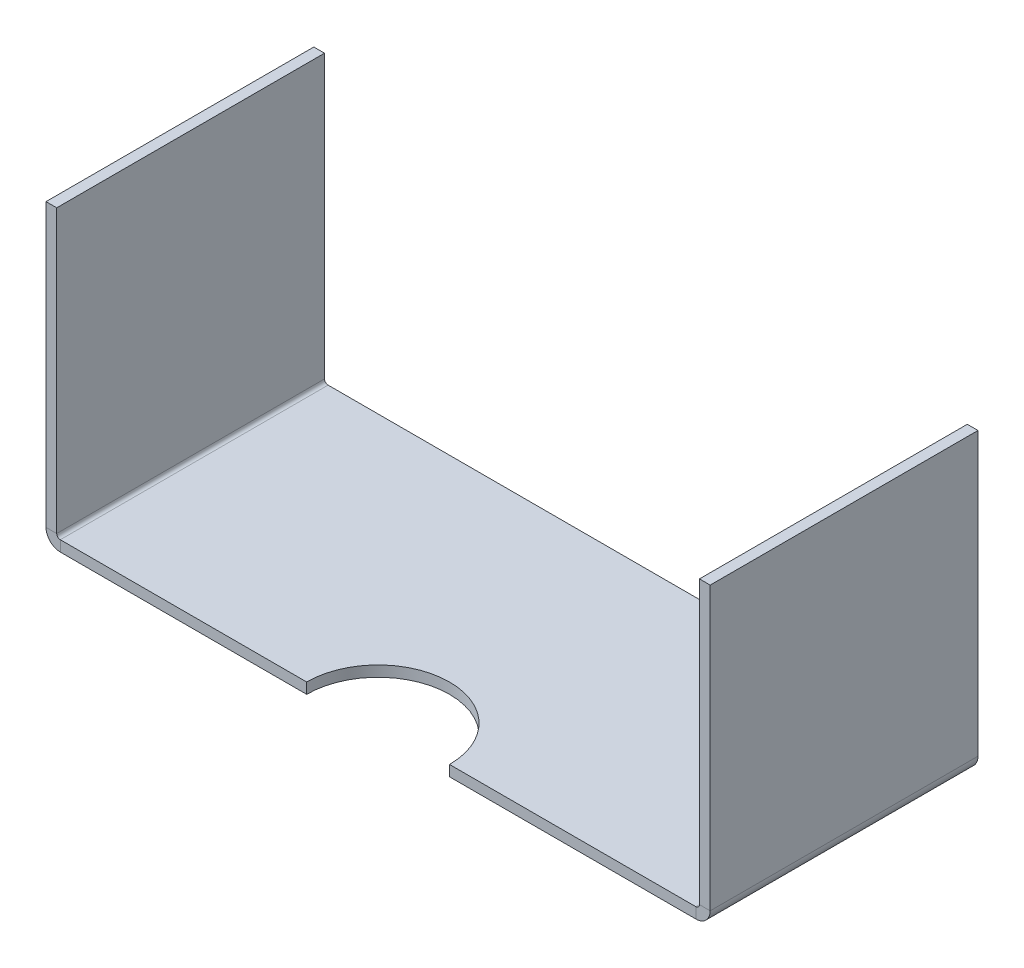
ISO-10303-21;
HEADER;
FILE_DESCRIPTION(('STEP AP214'),'2;1');
FILE_NAME('part.step','',(''),(''),'','','');
FILE_SCHEMA(('AUTOMOTIVE_DESIGN { 1 0 10303 214 1 1 1 1 }'));
ENDSEC;
DATA;
#1=APPLICATION_CONTEXT('core data for automotive mechanical design processes');
#2=APPLICATION_PROTOCOL_DEFINITION('international standard','automotive_design',2000,#1);
#3=PRODUCT_CONTEXT('',#1,'mechanical');
#4=PRODUCT('Part','Part','',(#3));
#5=PRODUCT_RELATED_PRODUCT_CATEGORY('part','',(#4));
#6=PRODUCT_DEFINITION_FORMATION('','',#4);
#7=PRODUCT_DEFINITION_CONTEXT('part definition',#1,'design');
#8=PRODUCT_DEFINITION('design','',#6,#7);
#9=PRODUCT_DEFINITION_SHAPE('','',#8);
#10=(LENGTH_UNIT() NAMED_UNIT(*) SI_UNIT(.MILLI.,.METRE.));
#11=(NAMED_UNIT(*) PLANE_ANGLE_UNIT() SI_UNIT($,.RADIAN.));
#12=(NAMED_UNIT(*) SI_UNIT($,.STERADIAN.) SOLID_ANGLE_UNIT());
#13=UNCERTAINTY_MEASURE_WITH_UNIT(LENGTH_MEASURE(1.E-05),#10,'distance_accuracy_value','');
#14=(GEOMETRIC_REPRESENTATION_CONTEXT(3) GLOBAL_UNCERTAINTY_ASSIGNED_CONTEXT((#13)) GLOBAL_UNIT_ASSIGNED_CONTEXT((#10,
#11,#12)) REPRESENTATION_CONTEXT('',''));
#15=CARTESIAN_POINT('',(0.,0.,0.));
#16=DIRECTION('',(0.,0.,1.));
#17=DIRECTION('',(1.,0.,0.));
#18=AXIS2_PLACEMENT_3D('',#15,#16,#17);
#19=CARTESIAN_POINT('',(-3.,1.,75.));
#20=DIRECTION('',(0.,0.,1.));
#21=DIRECTION('',(1.,0.,0.));
#22=AXIS2_PLACEMENT_3D('',#19,#20,#21);
#23=PLANE('',#22);
#24=DIRECTION('',(0.,1.,0.));
#25=VECTOR('',#24,1.);
#26=CARTESIAN_POINT('',(110.,-3.,75.));
#27=LINE('',#26,#25);
#28=CARTESIAN_POINT('',(110.,-3.,75.));
#29=VERTEX_POINT('',#28);
#30=CARTESIAN_POINT('',(110.,0.,75.));
#31=VERTEX_POINT('',#30);
#32=EDGE_CURVE('E184',#29,#31,#27,.T.);
#33=ORIENTED_EDGE('',*,*,#32,.F.);
#34=DIRECTION('',(1.,0.,0.));
#35=VECTOR('',#34,1.);
#36=CARTESIAN_POINT('',(0.,-3.,75.));
#37=LINE('',#36,#35);
#38=CARTESIAN_POINT('',(179.,-3.,75.));
#39=VERTEX_POINT('',#38);
#40=EDGE_CURVE('E156',#29,#39,#37,.T.);
#41=ORIENTED_EDGE('',*,*,#40,.T.);
#42=DIRECTION('',(1.11022302462516E-13,1.,0.));
#43=VECTOR('',#42,1.);
#44=CARTESIAN_POINT('',(179.,-3.,75.));
#45=LINE('',#44,#43);
#46=CARTESIAN_POINT('',(179.,0.,75.));
#47=VERTEX_POINT('',#46);
#48=EDGE_CURVE('E240',#39,#47,#45,.T.);
#49=ORIENTED_EDGE('',*,*,#48,.T.);
#50=DIRECTION('',(1.,0.,0.));
#51=VECTOR('',#50,1.);
#52=CARTESIAN_POINT('',(0.,0.,75.));
#53=LINE('',#52,#51);
#54=EDGE_CURVE('E270',#31,#47,#53,.T.);
#55=ORIENTED_EDGE('',*,*,#54,.F.);
#56=EDGE_LOOP('',(#33,#41,#49,#55));
#57=FACE_BOUND('',#56,.T.);
#58=ADVANCED_FACE('F35',(#57),#23,.T.);
#59=CARTESIAN_POINT('',(0.999999999999999,0.,75.));
#60=DIRECTION('',(0.,0.,1.));
#61=DIRECTION('',(1.,0.,0.));
#62=AXIS2_PLACEMENT_3D('',#59,#60,#61);
#63=PLANE('',#62);
#64=DIRECTION('',(0.,-1.,0.));
#65=VECTOR('',#64,1.);
#66=CARTESIAN_POINT('',(0.999999999999999,0.,75.));
#67=LINE('',#66,#65);
#68=CARTESIAN_POINT('',(0.999999999999999,0.,75.));
#69=VERTEX_POINT('',#68);
#70=CARTESIAN_POINT('',(0.999999999999999,-3.,75.));
#71=VERTEX_POINT('',#70);
#72=EDGE_CURVE('E11',#69,#71,#67,.T.);
#73=ORIENTED_EDGE('',*,*,#72,.F.);
#74=CARTESIAN_POINT('',(1.,1.,75.));
#75=DIRECTION('',(0.,0.,-1.));
#76=DIRECTION('',(-1.,0.,0.));
#77=AXIS2_PLACEMENT_3D('',#74,#75,#76);
#78=CIRCLE('',#77,1.);
#79=CARTESIAN_POINT('',(0.,1.,75.));
#80=VERTEX_POINT('',#79);
#81=EDGE_CURVE('E260',#80,#69,#78,.F.);
#82=ORIENTED_EDGE('',*,*,#81,.F.);
#83=DIRECTION('',(1.,0.,0.));
#84=VECTOR('',#83,1.);
#85=CARTESIAN_POINT('',(-3.,1.,75.));
#86=LINE('',#85,#84);
#87=CARTESIAN_POINT('',(-3.,1.,75.));
#88=VERTEX_POINT('',#87);
#89=EDGE_CURVE('E43',#88,#80,#86,.T.);
#90=ORIENTED_EDGE('',*,*,#89,.F.);
#91=CARTESIAN_POINT('',(1.,1.,75.));
#92=DIRECTION('',(0.,0.,1.));
#93=DIRECTION('',(1.,0.,0.));
#94=AXIS2_PLACEMENT_3D('',#91,#92,#93);
#95=CIRCLE('',#94,4.);
#96=EDGE_CURVE('E151',#88,#71,#95,.T.);
#97=ORIENTED_EDGE('',*,*,#96,.T.);
#98=EDGE_LOOP('',(#73,#82,#90,#97));
#99=FACE_BOUND('',#98,.T.);
#100=ADVANCED_FACE('F37',(#99),#63,.T.);
#101=DIRECTION('',(0.,1.,0.));
#102=VECTOR('',#101,1.);
#103=CARTESIAN_POINT('',(69.9999999999999,-3.,75.));
#104=LINE('',#103,#102);
#105=CARTESIAN_POINT('',(69.9999999999999,0.,75.));
#106=VERTEX_POINT('',#105);
#107=CARTESIAN_POINT('',(69.9999999999999,-3.,75.));
#108=VERTEX_POINT('',#107);
#109=EDGE_CURVE('E50',#106,#108,#104,.F.);
#110=ORIENTED_EDGE('',*,*,#109,.F.);
#111=EDGE_CURVE('E145',#69,#106,#53,.T.);
#112=ORIENTED_EDGE('',*,*,#111,.F.);
#113=ORIENTED_EDGE('',*,*,#72,.T.);
#114=EDGE_CURVE('E143',#71,#108,#37,.T.);
#115=ORIENTED_EDGE('',*,*,#114,.T.);
#116=EDGE_LOOP('',(#110,#112,#113,#115));
#117=FACE_BOUND('',#116,.T.);
#118=ADVANCED_FACE('F141',(#117),#23,.T.);
#119=CARTESIAN_POINT('',(0.,1.,0.));
#120=DIRECTION('',(0.,0.,-1.));
#121=DIRECTION('',(-1.,0.,0.));
#122=AXIS2_PLACEMENT_3D('',#119,#120,#121);
#123=PLANE('',#122);
#124=DIRECTION('',(-1.,0.,0.));
#125=VECTOR('',#124,1.);
#126=CARTESIAN_POINT('',(0.,1.,0.));
#127=LINE('',#126,#125);
#128=CARTESIAN_POINT('',(0.,1.,0.));
#129=VERTEX_POINT('',#128);
#130=CARTESIAN_POINT('',(-3.,1.,0.));
#131=VERTEX_POINT('',#130);
#132=EDGE_CURVE('E246',#129,#131,#127,.T.);
#133=ORIENTED_EDGE('',*,*,#132,.F.);
#134=CARTESIAN_POINT('',(1.,1.,0.));
#135=DIRECTION('',(0.,0.,-1.));
#136=DIRECTION('',(-1.,0.,0.));
#137=AXIS2_PLACEMENT_3D('',#134,#135,#136);
#138=CIRCLE('',#137,1.);
#139=CARTESIAN_POINT('',(0.999999999999999,0.,0.));
#140=VERTEX_POINT('',#139);
#141=EDGE_CURVE('E195',#129,#140,#138,.F.);
#142=ORIENTED_EDGE('',*,*,#141,.T.);
#143=DIRECTION('',(0.,1.,0.));
#144=VECTOR('',#143,1.);
#145=CARTESIAN_POINT('',(0.999999999999999,-3.,0.));
#146=LINE('',#145,#144);
#147=CARTESIAN_POINT('',(0.999999999999999,-3.,0.));
#148=VERTEX_POINT('',#147);
#149=EDGE_CURVE('E244',#148,#140,#146,.T.);
#150=ORIENTED_EDGE('',*,*,#149,.F.);
#151=CARTESIAN_POINT('',(1.,1.,0.));
#152=DIRECTION('',(0.,0.,1.));
#153=DIRECTION('',(1.,0.,0.));
#154=AXIS2_PLACEMENT_3D('',#151,#152,#153);
#155=CIRCLE('',#154,4.);
#156=EDGE_CURVE('E164',#131,#148,#155,.T.);
#157=ORIENTED_EDGE('',*,*,#156,.F.);
#158=EDGE_LOOP('',(#133,#142,#150,#157));
#159=FACE_BOUND('',#158,.T.);
#160=ADVANCED_FACE('F298',(#159),#123,.T.);
#161=CARTESIAN_POINT('',(0.999999999999999,-3.,0.));
#162=DIRECTION('',(0.,0.,-1.));
#163=DIRECTION('',(-1.,0.,0.));
#164=AXIS2_PLACEMENT_3D('',#161,#162,#163);
#165=PLANE('',#164);
#166=DIRECTION('',(0.,-1.,0.));
#167=VECTOR('',#166,1.);
#168=CARTESIAN_POINT('',(0.,0.,0.));
#169=LINE('',#168,#167);
#170=CARTESIAN_POINT('',(0.,80.,0.));
#171=VERTEX_POINT('',#170);
#172=EDGE_CURVE('E198',#171,#129,#169,.T.);
#173=ORIENTED_EDGE('',*,*,#172,.T.);
#174=ORIENTED_EDGE('',*,*,#132,.T.);
#175=DIRECTION('',(0.,1.,0.));
#176=VECTOR('',#175,1.);
#177=CARTESIAN_POINT('',(-3.,0.,0.));
#178=LINE('',#177,#176);
#179=CARTESIAN_POINT('',(-3.,80.,0.));
#180=VERTEX_POINT('',#179);
#181=EDGE_CURVE('E204',#180,#131,#178,.F.);
#182=ORIENTED_EDGE('',*,*,#181,.F.);
#183=DIRECTION('',(1.,0.,0.));
#184=VECTOR('',#183,1.);
#185=CARTESIAN_POINT('',(-3.,80.,0.));
#186=LINE('',#185,#184);
#187=EDGE_CURVE('E201',#180,#171,#186,.T.);
#188=ORIENTED_EDGE('',*,*,#187,.T.);
#189=EDGE_LOOP('',(#173,#174,#182,#188));
#190=FACE_BOUND('',#189,.T.);
#191=ADVANCED_FACE('F301',(#190),#165,.T.);
#192=CARTESIAN_POINT('',(180.,1.,75.));
#193=DIRECTION('',(0.,0.,1.));
#194=DIRECTION('',(1.,0.,0.));
#195=AXIS2_PLACEMENT_3D('',#192,#193,#194);
#196=PLANE('',#195);
#197=DIRECTION('',(1.,0.,0.));
#198=VECTOR('',#197,1.);
#199=CARTESIAN_POINT('',(180.,1.,75.));
#200=LINE('',#199,#198);
#201=CARTESIAN_POINT('',(180.,1.,75.));
#202=VERTEX_POINT('',#201);
#203=CARTESIAN_POINT('',(183.,1.,75.));
#204=VERTEX_POINT('',#203);
#205=EDGE_CURVE('E59',#202,#204,#200,.T.);
#206=ORIENTED_EDGE('',*,*,#205,.F.);
#207=CARTESIAN_POINT('',(179.,1.,75.));
#208=DIRECTION('',(0.,0.,-1.));
#209=DIRECTION('',(-1.,0.,0.));
#210=AXIS2_PLACEMENT_3D('',#207,#208,#209);
#211=CIRCLE('',#210,1.);
#212=EDGE_CURVE('E271',#47,#202,#211,.F.);
#213=ORIENTED_EDGE('',*,*,#212,.F.);
#214=ORIENTED_EDGE('',*,*,#48,.F.);
#215=CARTESIAN_POINT('',(179.,1.,75.));
#216=DIRECTION('',(0.,0.,1.));
#217=DIRECTION('',(1.,0.,0.));
#218=AXIS2_PLACEMENT_3D('',#215,#216,#217);
#219=CIRCLE('',#218,4.);
#220=EDGE_CURVE('E174',#39,#204,#219,.T.);
#221=ORIENTED_EDGE('',*,*,#220,.T.);
#222=EDGE_LOOP('',(#206,#213,#214,#221));
#223=FACE_BOUND('',#222,.T.);
#224=ADVANCED_FACE('F328',(#223),#196,.T.);
#225=CARTESIAN_POINT('',(179.,-3.,75.));
#226=DIRECTION('',(0.,0.,1.));
#227=DIRECTION('',(1.,0.,0.));
#228=AXIS2_PLACEMENT_3D('',#225,#226,#227);
#229=PLANE('',#228);
#230=DIRECTION('',(0.,1.,0.));
#231=VECTOR('',#230,1.);
#232=CARTESIAN_POINT('',(180.,0.,75.));
#233=LINE('',#232,#231);
#234=CARTESIAN_POINT('',(180.,80.,75.));
#235=VERTEX_POINT('',#234);
#236=EDGE_CURVE('E274',#202,#235,#233,.T.);
#237=ORIENTED_EDGE('',*,*,#236,.F.);
#238=ORIENTED_EDGE('',*,*,#205,.T.);
#239=DIRECTION('',(0.,1.,0.));
#240=VECTOR('',#239,1.);
#241=CARTESIAN_POINT('',(183.,0.,75.));
#242=LINE('',#241,#240);
#243=CARTESIAN_POINT('',(183.,80.,75.));
#244=VERTEX_POINT('',#243);
#245=EDGE_CURVE('E111',#204,#244,#242,.T.);
#246=ORIENTED_EDGE('',*,*,#245,.T.);
#247=DIRECTION('',(1.,0.,0.));
#248=VECTOR('',#247,1.);
#249=CARTESIAN_POINT('',(180.,80.,75.));
#250=LINE('',#249,#248);
#251=EDGE_CURVE('E277',#235,#244,#250,.T.);
#252=ORIENTED_EDGE('',*,*,#251,.F.);
#253=EDGE_LOOP('',(#237,#238,#246,#252));
#254=FACE_BOUND('',#253,.T.);
#255=ADVANCED_FACE('F333',(#254),#229,.T.);
#256=CARTESIAN_POINT('',(179.,0.,0.));
#257=DIRECTION('',(0.,0.,-1.));
#258=DIRECTION('',(-1.,0.,0.));
#259=AXIS2_PLACEMENT_3D('',#256,#257,#258);
#260=PLANE('',#259);
#261=DIRECTION('',(-1.11022302462516E-13,-1.,0.));
#262=VECTOR('',#261,1.);
#263=CARTESIAN_POINT('',(179.,0.,0.));
#264=LINE('',#263,#262);
#265=CARTESIAN_POINT('',(179.,0.,0.));
#266=VERTEX_POINT('',#265);
#267=CARTESIAN_POINT('',(179.,-3.,0.));
#268=VERTEX_POINT('',#267);
#269=EDGE_CURVE('E238',#266,#268,#264,.T.);
#270=ORIENTED_EDGE('',*,*,#269,.F.);
#271=CARTESIAN_POINT('',(179.,1.,0.));
#272=DIRECTION('',(0.,0.,-1.));
#273=DIRECTION('',(-1.,0.,0.));
#274=AXIS2_PLACEMENT_3D('',#271,#272,#273);
#275=CIRCLE('',#274,1.);
#276=CARTESIAN_POINT('',(180.,1.,0.));
#277=VERTEX_POINT('',#276);
#278=EDGE_CURVE('E190',#266,#277,#275,.F.);
#279=ORIENTED_EDGE('',*,*,#278,.T.);
#280=DIRECTION('',(-1.,0.,0.));
#281=VECTOR('',#280,1.);
#282=CARTESIAN_POINT('',(183.,1.,0.));
#283=LINE('',#282,#281);
#284=CARTESIAN_POINT('',(183.,1.,0.));
#285=VERTEX_POINT('',#284);
#286=EDGE_CURVE('E105',#285,#277,#283,.T.);
#287=ORIENTED_EDGE('',*,*,#286,.F.);
#288=CARTESIAN_POINT('',(179.,1.,0.));
#289=DIRECTION('',(0.,0.,1.));
#290=DIRECTION('',(1.,0.,0.));
#291=AXIS2_PLACEMENT_3D('',#288,#289,#290);
#292=CIRCLE('',#291,4.);
#293=EDGE_CURVE('E210',#268,#285,#292,.T.);
#294=ORIENTED_EDGE('',*,*,#293,.F.);
#295=EDGE_LOOP('',(#270,#279,#287,#294));
#296=FACE_BOUND('',#295,.T.);
#297=ADVANCED_FACE('F337',(#296),#260,.T.);
#298=CARTESIAN_POINT('',(183.,1.,0.));
#299=DIRECTION('',(0.,0.,-1.));
#300=DIRECTION('',(-1.,0.,0.));
#301=AXIS2_PLACEMENT_3D('',#298,#299,#300);
#302=PLANE('',#301);
#303=DIRECTION('',(1.,0.,0.));
#304=VECTOR('',#303,1.);
#305=CARTESIAN_POINT('',(0.,0.,0.));
#306=LINE('',#305,#304);
#307=EDGE_CURVE('E192',#140,#266,#306,.T.);
#308=ORIENTED_EDGE('',*,*,#307,.T.);
#309=ORIENTED_EDGE('',*,*,#269,.T.);
#310=DIRECTION('',(1.,0.,0.));
#311=VECTOR('',#310,1.);
#312=CARTESIAN_POINT('',(0.,-3.,0.));
#313=LINE('',#312,#311);
#314=EDGE_CURVE('E208',#148,#268,#313,.T.);
#315=ORIENTED_EDGE('',*,*,#314,.F.);
#316=ORIENTED_EDGE('',*,*,#149,.T.);
#317=EDGE_LOOP('',(#308,#309,#315,#316));
#318=FACE_BOUND('',#317,.T.);
#319=ADVANCED_FACE('F340',(#318),#302,.T.);
#320=CARTESIAN_POINT('',(183.,0.,75.));
#321=DIRECTION('',(-1.,0.,0.));
#322=DIRECTION('',(0.,0.,1.));
#323=AXIS2_PLACEMENT_3D('',#320,#321,#322);
#324=PLANE('',#323);
#325=DIRECTION('',(0.,1.,0.));
#326=VECTOR('',#325,1.);
#327=CARTESIAN_POINT('',(183.,0.,0.));
#328=LINE('',#327,#326);
#329=CARTESIAN_POINT('',(183.,80.,0.));
#330=VERTEX_POINT('',#329);
#331=EDGE_CURVE('E180',#285,#330,#328,.T.);
#332=ORIENTED_EDGE('',*,*,#331,.T.);
#333=DIRECTION('',(0.,0.,-1.));
#334=VECTOR('',#333,1.);
#335=CARTESIAN_POINT('',(183.,80.,75.));
#336=LINE('',#335,#334);
#337=EDGE_CURVE('E235',#244,#330,#336,.T.);
#338=ORIENTED_EDGE('',*,*,#337,.F.);
#339=ORIENTED_EDGE('',*,*,#245,.F.);
#340=DIRECTION('',(0.,0.,-1.));
#341=VECTOR('',#340,1.);
#342=CARTESIAN_POINT('',(183.,1.,75.));
#343=LINE('',#342,#341);
#344=EDGE_CURVE('E176',#204,#285,#343,.T.);
#345=ORIENTED_EDGE('',*,*,#344,.T.);
#346=EDGE_LOOP('',(#332,#338,#339,#345));
#347=FACE_BOUND('',#346,.T.);
#348=ADVANCED_FACE('F343',(#347),#324,.F.);
#349=CARTESIAN_POINT('',(180.,80.,75.));
#350=DIRECTION('',(0.,1.,0.));
#351=DIRECTION('',(0.,0.,1.));
#352=AXIS2_PLACEMENT_3D('',#349,#350,#351);
#353=PLANE('',#352);
#354=DIRECTION('',(1.,0.,0.));
#355=VECTOR('',#354,1.);
#356=CARTESIAN_POINT('',(180.,80.,0.));
#357=LINE('',#356,#355);
#358=CARTESIAN_POINT('',(180.,80.,0.));
#359=VERTEX_POINT('',#358);
#360=EDGE_CURVE('E183',#359,#330,#357,.T.);
#361=ORIENTED_EDGE('',*,*,#360,.F.);
#362=DIRECTION('',(0.,0.,-1.));
#363=VECTOR('',#362,1.);
#364=CARTESIAN_POINT('',(180.,80.,75.));
#365=LINE('',#364,#363);
#366=EDGE_CURVE('E233',#235,#359,#365,.T.);
#367=ORIENTED_EDGE('',*,*,#366,.F.);
#368=ORIENTED_EDGE('',*,*,#251,.T.);
#369=ORIENTED_EDGE('',*,*,#337,.T.);
#370=EDGE_LOOP('',(#361,#367,#368,#369));
#371=FACE_BOUND('',#370,.T.);
#372=ADVANCED_FACE('F346',(#371),#353,.T.);
#373=CARTESIAN_POINT('',(180.,0.,75.));
#374=DIRECTION('',(-1.,0.,0.));
#375=DIRECTION('',(0.,0.,1.));
#376=AXIS2_PLACEMENT_3D('',#373,#374,#375);
#377=PLANE('',#376);
#378=DIRECTION('',(0.,1.,0.));
#379=VECTOR('',#378,1.);
#380=CARTESIAN_POINT('',(180.,0.,0.));
#381=LINE('',#380,#379);
#382=EDGE_CURVE('E187',#277,#359,#381,.T.);
#383=ORIENTED_EDGE('',*,*,#382,.F.);
#384=DIRECTION('',(0.,0.,-1.));
#385=VECTOR('',#384,1.);
#386=CARTESIAN_POINT('',(180.,1.,75.));
#387=LINE('',#386,#385);
#388=EDGE_CURVE('E230',#202,#277,#387,.T.);
#389=ORIENTED_EDGE('',*,*,#388,.F.);
#390=ORIENTED_EDGE('',*,*,#236,.T.);
#391=ORIENTED_EDGE('',*,*,#366,.T.);
#392=EDGE_LOOP('',(#383,#389,#390,#391));
#393=FACE_BOUND('',#392,.T.);
#394=ADVANCED_FACE('F350',(#393),#377,.T.);
#395=CARTESIAN_POINT('',(179.,1.,75.));
#396=DIRECTION('',(0.,0.,-1.));
#397=DIRECTION('',(-1.,0.,0.));
#398=AXIS2_PLACEMENT_3D('',#395,#396,#397);
#399=CYLINDRICAL_SURFACE('',#398,1.);
#400=ORIENTED_EDGE('',*,*,#278,.F.);
#401=DIRECTION('',(0.,0.,-1.));
#402=VECTOR('',#401,1.);
#403=CARTESIAN_POINT('',(179.,0.,75.));
#404=LINE('',#403,#402);
#405=EDGE_CURVE('E227',#47,#266,#404,.T.);
#406=ORIENTED_EDGE('',*,*,#405,.F.);
#407=ORIENTED_EDGE('',*,*,#212,.T.);
#408=ORIENTED_EDGE('',*,*,#388,.T.);
#409=EDGE_LOOP('',(#400,#406,#407,#408));
#410=FACE_BOUND('',#409,.T.);
#411=ADVANCED_FACE('F354',(#410),#399,.F.);
#412=CARTESIAN_POINT('',(0.,0.,75.));
#413=DIRECTION('',(0.,1.,0.));
#414=DIRECTION('',(0.,0.,1.));
#415=AXIS2_PLACEMENT_3D('',#412,#413,#414);
#416=PLANE('',#415);
#417=CARTESIAN_POINT('',(89.9999999999999,0.,75.));
#418=DIRECTION('',(0.,1.,0.));
#419=DIRECTION('',(0.,0.,1.));
#420=AXIS2_PLACEMENT_3D('',#417,#418,#419);
#421=CIRCLE('',#420,20.);
#422=EDGE_CURVE('E284',#31,#106,#421,.T.);
#423=ORIENTED_EDGE('',*,*,#422,.F.);
#424=ORIENTED_EDGE('',*,*,#54,.T.);
#425=ORIENTED_EDGE('',*,*,#405,.T.);
#426=ORIENTED_EDGE('',*,*,#307,.F.);
#427=DIRECTION('',(0.,0.,-1.));
#428=VECTOR('',#427,1.);
#429=CARTESIAN_POINT('',(0.999999999999999,0.,75.));
#430=LINE('',#429,#428);
#431=EDGE_CURVE('E224',#69,#140,#430,.T.);
#432=ORIENTED_EDGE('',*,*,#431,.F.);
#433=ORIENTED_EDGE('',*,*,#111,.T.);
#434=EDGE_LOOP('',(#423,#424,#425,#426,#432,#433));
#435=FACE_BOUND('',#434,.T.);
#436=ADVANCED_FACE('F292',(#435),#416,.T.);
#437=CARTESIAN_POINT('',(1.,1.,75.));
#438=DIRECTION('',(0.,0.,-1.));
#439=DIRECTION('',(-1.,0.,0.));
#440=AXIS2_PLACEMENT_3D('',#437,#438,#439);
#441=CYLINDRICAL_SURFACE('',#440,1.);
#442=ORIENTED_EDGE('',*,*,#141,.F.);
#443=DIRECTION('',(0.,0.,-1.));
#444=VECTOR('',#443,1.);
#445=CARTESIAN_POINT('',(0.,1.,75.));
#446=LINE('',#445,#444);
#447=EDGE_CURVE('E221',#80,#129,#446,.T.);
#448=ORIENTED_EDGE('',*,*,#447,.F.);
#449=ORIENTED_EDGE('',*,*,#81,.T.);
#450=ORIENTED_EDGE('',*,*,#431,.T.);
#451=EDGE_LOOP('',(#442,#448,#449,#450));
#452=FACE_BOUND('',#451,.T.);
#453=ADVANCED_FACE('F259',(#452),#441,.F.);
#454=CARTESIAN_POINT('',(0.,0.,75.));
#455=DIRECTION('',(1.,0.,0.));
#456=DIRECTION('',(0.,0.,-1.));
#457=AXIS2_PLACEMENT_3D('',#454,#455,#456);
#458=PLANE('',#457);
#459=ORIENTED_EDGE('',*,*,#172,.F.);
#460=DIRECTION('',(0.,0.,-1.));
#461=VECTOR('',#460,1.);
#462=CARTESIAN_POINT('',(0.,80.,75.));
#463=LINE('',#462,#461);
#464=CARTESIAN_POINT('',(0.,80.,75.));
#465=VERTEX_POINT('',#464);
#466=EDGE_CURVE('E219',#465,#171,#463,.T.);
#467=ORIENTED_EDGE('',*,*,#466,.F.);
#468=DIRECTION('',(0.,-1.,0.));
#469=VECTOR('',#468,1.);
#470=CARTESIAN_POINT('',(0.,0.,75.));
#471=LINE('',#470,#469);
#472=EDGE_CURVE('E253',#465,#80,#471,.T.);
#473=ORIENTED_EDGE('',*,*,#472,.T.);
#474=ORIENTED_EDGE('',*,*,#447,.T.);
#475=EDGE_LOOP('',(#459,#467,#473,#474));
#476=FACE_BOUND('',#475,.T.);
#477=ADVANCED_FACE('F264',(#476),#458,.T.);
#478=CARTESIAN_POINT('',(-3.,80.,75.));
#479=DIRECTION('',(0.,1.,0.));
#480=DIRECTION('',(0.,0.,1.));
#481=AXIS2_PLACEMENT_3D('',#478,#479,#480);
#482=PLANE('',#481);
#483=ORIENTED_EDGE('',*,*,#187,.F.);
#484=DIRECTION('',(0.,0.,-1.));
#485=VECTOR('',#484,1.);
#486=CARTESIAN_POINT('',(-3.,80.,75.));
#487=LINE('',#486,#485);
#488=CARTESIAN_POINT('',(-3.,80.,75.));
#489=VERTEX_POINT('',#488);
#490=EDGE_CURVE('E217',#489,#180,#487,.T.);
#491=ORIENTED_EDGE('',*,*,#490,.F.);
#492=DIRECTION('',(1.,0.,0.));
#493=VECTOR('',#492,1.);
#494=CARTESIAN_POINT('',(-3.,80.,75.));
#495=LINE('',#494,#493);
#496=EDGE_CURVE('E265',#489,#465,#495,.T.);
#497=ORIENTED_EDGE('',*,*,#496,.T.);
#498=ORIENTED_EDGE('',*,*,#466,.T.);
#499=EDGE_LOOP('',(#483,#491,#497,#498));
#500=FACE_BOUND('',#499,.T.);
#501=ADVANCED_FACE('F306',(#500),#482,.T.);
#502=CARTESIAN_POINT('',(-3.,0.,75.));
#503=DIRECTION('',(1.,0.,0.));
#504=DIRECTION('',(0.,0.,-1.));
#505=AXIS2_PLACEMENT_3D('',#502,#503,#504);
#506=PLANE('',#505);
#507=ORIENTED_EDGE('',*,*,#181,.T.);
#508=DIRECTION('',(0.,0.,-1.));
#509=VECTOR('',#508,1.);
#510=CARTESIAN_POINT('',(-3.,1.,75.));
#511=LINE('',#510,#509);
#512=EDGE_CURVE('E168',#88,#131,#511,.T.);
#513=ORIENTED_EDGE('',*,*,#512,.F.);
#514=DIRECTION('',(0.,1.,0.));
#515=VECTOR('',#514,1.);
#516=CARTESIAN_POINT('',(-3.,0.,75.));
#517=LINE('',#516,#515);
#518=EDGE_CURVE('E157',#489,#88,#517,.F.);
#519=ORIENTED_EDGE('',*,*,#518,.F.);
#520=ORIENTED_EDGE('',*,*,#490,.T.);
#521=EDGE_LOOP('',(#507,#513,#519,#520));
#522=FACE_BOUND('',#521,.T.);
#523=ADVANCED_FACE('F304',(#522),#506,.F.);
#524=CARTESIAN_POINT('',(1.,1.,75.));
#525=DIRECTION('',(0.,0.,-1.));
#526=DIRECTION('',(-1.,0.,0.));
#527=AXIS2_PLACEMENT_3D('',#524,#525,#526);
#528=CYLINDRICAL_SURFACE('',#527,4.);
#529=ORIENTED_EDGE('',*,*,#156,.T.);
#530=DIRECTION('',(0.,0.,-1.));
#531=VECTOR('',#530,1.);
#532=CARTESIAN_POINT('',(0.999999999999999,-3.,75.));
#533=LINE('',#532,#531);
#534=EDGE_CURVE('E161',#71,#148,#533,.T.);
#535=ORIENTED_EDGE('',*,*,#534,.F.);
#536=ORIENTED_EDGE('',*,*,#96,.F.);
#537=ORIENTED_EDGE('',*,*,#512,.T.);
#538=EDGE_LOOP('',(#529,#535,#536,#537));
#539=FACE_BOUND('',#538,.T.);
#540=ADVANCED_FACE('F162',(#539),#528,.T.);
#541=CARTESIAN_POINT('',(0.,-3.,75.));
#542=DIRECTION('',(0.,1.,0.));
#543=DIRECTION('',(0.,0.,1.));
#544=AXIS2_PLACEMENT_3D('',#541,#542,#543);
#545=PLANE('',#544);
#546=ORIENTED_EDGE('',*,*,#40,.F.);
#547=CARTESIAN_POINT('',(89.9999999999999,-3.,75.));
#548=DIRECTION('',(0.,1.,0.));
#549=DIRECTION('',(0.,0.,1.));
#550=AXIS2_PLACEMENT_3D('',#547,#548,#549);
#551=CIRCLE('',#550,20.);
#552=EDGE_CURVE('E173',#29,#108,#551,.T.);
#553=ORIENTED_EDGE('',*,*,#552,.T.);
#554=ORIENTED_EDGE('',*,*,#114,.F.);
#555=ORIENTED_EDGE('',*,*,#534,.T.);
#556=ORIENTED_EDGE('',*,*,#314,.T.);
#557=DIRECTION('',(0.,0.,-1.));
#558=VECTOR('',#557,1.);
#559=CARTESIAN_POINT('',(179.,-3.,75.));
#560=LINE('',#559,#558);
#561=EDGE_CURVE('E169',#39,#268,#560,.T.);
#562=ORIENTED_EDGE('',*,*,#561,.F.);
#563=EDGE_LOOP('',(#546,#553,#554,#555,#556,#562));
#564=FACE_BOUND('',#563,.T.);
#565=ADVANCED_FACE('F172',(#564),#545,.F.);
#566=CARTESIAN_POINT('',(179.,1.,75.));
#567=DIRECTION('',(0.,0.,-1.));
#568=DIRECTION('',(-1.,0.,0.));
#569=AXIS2_PLACEMENT_3D('',#566,#567,#568);
#570=CYLINDRICAL_SURFACE('',#569,4.);
#571=ORIENTED_EDGE('',*,*,#293,.T.);
#572=ORIENTED_EDGE('',*,*,#344,.F.);
#573=ORIENTED_EDGE('',*,*,#220,.F.);
#574=ORIENTED_EDGE('',*,*,#561,.T.);
#575=EDGE_LOOP('',(#571,#572,#573,#574));
#576=FACE_BOUND('',#575,.T.);
#577=ADVANCED_FACE('F400',(#576),#570,.T.);
#578=CARTESIAN_POINT('',(179.,1.,75.));
#579=DIRECTION('',(0.,0.,-1.));
#580=DIRECTION('',(-1.,0.,0.));
#581=AXIS2_PLACEMENT_3D('',#578,#579,#580);
#582=PLANE('',#581);
#583=ORIENTED_EDGE('',*,*,#518,.T.);
#584=ORIENTED_EDGE('',*,*,#89,.T.);
#585=ORIENTED_EDGE('',*,*,#472,.F.);
#586=ORIENTED_EDGE('',*,*,#496,.F.);
#587=EDGE_LOOP('',(#583,#584,#585,#586));
#588=FACE_BOUND('',#587,.T.);
#589=ADVANCED_FACE('F250',(#588),#582,.F.);
#590=CARTESIAN_POINT('',(179.,1.,0.));
#591=DIRECTION('',(0.,0.,-1.));
#592=DIRECTION('',(-1.,0.,0.));
#593=AXIS2_PLACEMENT_3D('',#590,#591,#592);
#594=PLANE('',#593);
#595=ORIENTED_EDGE('',*,*,#331,.F.);
#596=ORIENTED_EDGE('',*,*,#286,.T.);
#597=ORIENTED_EDGE('',*,*,#382,.T.);
#598=ORIENTED_EDGE('',*,*,#360,.T.);
#599=EDGE_LOOP('',(#595,#596,#597,#598));
#600=FACE_BOUND('',#599,.T.);
#601=ADVANCED_FACE('F415',(#600),#594,.T.);
#602=CARTESIAN_POINT('',(89.9999999999999,-3.,75.));
#603=DIRECTION('',(0.,1.,0.));
#604=DIRECTION('',(0.,0.,1.));
#605=AXIS2_PLACEMENT_3D('',#602,#603,#604);
#606=CYLINDRICAL_SURFACE('',#605,20.);
#607=ORIENTED_EDGE('',*,*,#32,.T.);
#608=ORIENTED_EDGE('',*,*,#422,.T.);
#609=ORIENTED_EDGE('',*,*,#109,.T.);
#610=ORIENTED_EDGE('',*,*,#552,.F.);
#611=EDGE_LOOP('',(#607,#608,#609,#610));
#612=FACE_BOUND('',#611,.T.);
#613=ADVANCED_FACE('F287',(#612),#606,.F.);
#614=CLOSED_SHELL('',(#58,#100,#118,#160,#191,#224,#255,#297,#319,#348,#372,#394,#411,#436,#453,
#477,#501,#523,#540,#565,#577,#589,#601,#613));
#615=MANIFOLD_SOLID_BREP('B2',#614);
#616=ADVANCED_BREP_SHAPE_REPRESENTATION('',(#18,#615),#14);
#617=SHAPE_DEFINITION_REPRESENTATION(#9,#616);
ENDSEC;
END-ISO-10303-21;
